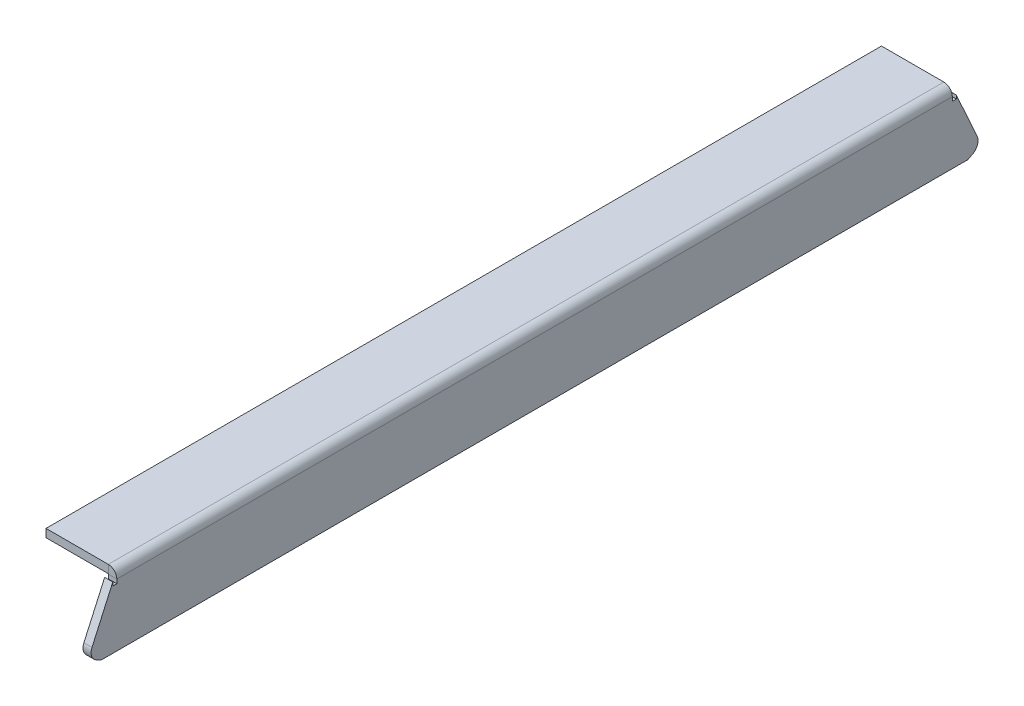
ISO-10303-21;
HEADER;
FILE_DESCRIPTION(('STEP AP214'),'2;1');
FILE_NAME('part.step','',(''),(''),'','','');
FILE_SCHEMA(('AUTOMOTIVE_DESIGN { 1 0 10303 214 1 1 1 1 }'));
ENDSEC;
DATA;
#1=APPLICATION_CONTEXT('core data for automotive mechanical design processes');
#2=APPLICATION_PROTOCOL_DEFINITION('international standard','automotive_design',2000,#1);
#3=PRODUCT_CONTEXT('',#1,'mechanical');
#4=PRODUCT('Part','Part','',(#3));
#5=PRODUCT_RELATED_PRODUCT_CATEGORY('part','',(#4));
#6=PRODUCT_DEFINITION_FORMATION('','',#4);
#7=PRODUCT_DEFINITION_CONTEXT('part definition',#1,'design');
#8=PRODUCT_DEFINITION('design','',#6,#7);
#9=PRODUCT_DEFINITION_SHAPE('','',#8);
#10=(LENGTH_UNIT() NAMED_UNIT(*) SI_UNIT(.MILLI.,.METRE.));
#11=(NAMED_UNIT(*) PLANE_ANGLE_UNIT() SI_UNIT($,.RADIAN.));
#12=(NAMED_UNIT(*) SI_UNIT($,.STERADIAN.) SOLID_ANGLE_UNIT());
#13=UNCERTAINTY_MEASURE_WITH_UNIT(LENGTH_MEASURE(1.E-05),#10,'distance_accuracy_value','');
#14=(GEOMETRIC_REPRESENTATION_CONTEXT(3) GLOBAL_UNCERTAINTY_ASSIGNED_CONTEXT((#13)) GLOBAL_UNIT_ASSIGNED_CONTEXT((#10,
#11,#12)) REPRESENTATION_CONTEXT('',''));
#15=CARTESIAN_POINT('',(0.,0.,0.));
#16=DIRECTION('',(0.,0.,1.));
#17=DIRECTION('',(1.,0.,0.));
#18=AXIS2_PLACEMENT_3D('',#15,#16,#17);
#19=CARTESIAN_POINT('',(-4.,28.9045422304651,-190.350009652526));
#20=DIRECTION('',(0.,0.,1.));
#21=DIRECTION('',(1.,0.,0.));
#22=AXIS2_PLACEMENT_3D('',#19,#20,#21);
#23=PLANE('',#22);
#24=DIRECTION('',(0.,-1.,0.));
#25=VECTOR('',#24,1.);
#26=CARTESIAN_POINT('',(0.,3.99188176989845,-190.350009652526));
#27=LINE('',#26,#25);
#28=CARTESIAN_POINT('',(0.,28.9045422304651,-190.350009652526));
#29=VERTEX_POINT('',#28);
#30=CARTESIAN_POINT('',(0.,27.1558786366371,-190.350009652526));
#31=VERTEX_POINT('',#30);
#32=EDGE_CURVE('E13',#29,#31,#27,.T.);
#33=ORIENTED_EDGE('',*,*,#32,.F.);
#34=DIRECTION('',(1.,0.,0.));
#35=VECTOR('',#34,1.);
#36=CARTESIAN_POINT('',(-4.,28.9045422304651,-190.350009652526));
#37=LINE('',#36,#35);
#38=CARTESIAN_POINT('',(-4.,28.9045422304651,-190.350009652526));
#39=VERTEX_POINT('',#38);
#40=EDGE_CURVE('E224',#39,#29,#37,.T.);
#41=ORIENTED_EDGE('',*,*,#40,.F.);
#42=DIRECTION('',(0.,-1.,0.));
#43=VECTOR('',#42,1.);
#44=CARTESIAN_POINT('',(-4.,28.9045422304651,-190.350009652526));
#45=LINE('',#44,#43);
#46=CARTESIAN_POINT('',(-4.00000000000001,27.1558786366371,-190.350009652526));
#47=VERTEX_POINT('',#46);
#48=EDGE_CURVE('E163',#39,#47,#45,.T.);
#49=ORIENTED_EDGE('',*,*,#48,.T.);
#50=DIRECTION('',(1.,0.,0.));
#51=VECTOR('',#50,1.);
#52=CARTESIAN_POINT('',(-4.00000000000001,27.1558786366371,-190.350009652526));
#53=LINE('',#52,#51);
#54=EDGE_CURVE('E213',#47,#31,#53,.T.);
#55=ORIENTED_EDGE('',*,*,#54,.T.);
#56=EDGE_LOOP('',(#33,#41,#49,#55));
#57=FACE_BOUND('',#56,.T.);
#58=ADVANCED_FACE('F57',(#57),#23,.T.);
#59=CARTESIAN_POINT('',(-4.00000000000001,27.1558786366371,-190.350009652526));
#60=DIRECTION('',(0.,1.,0.));
#61=DIRECTION('',(0.,0.,1.));
#62=AXIS2_PLACEMENT_3D('',#59,#60,#61);
#63=PLANE('',#62);
#64=DIRECTION('',(0.,0.,1.));
#65=VECTOR('',#64,1.);
#66=CARTESIAN_POINT('',(0.,27.1558786366371,-196.061850042089));
#67=LINE('',#66,#65);
#68=CARTESIAN_POINT('',(0.,27.1558786366371,-188.350009652526));
#69=VERTEX_POINT('',#68);
#70=EDGE_CURVE('E65',#31,#69,#67,.T.);
#71=ORIENTED_EDGE('',*,*,#70,.F.);
#72=ORIENTED_EDGE('',*,*,#54,.F.);
#73=DIRECTION('',(0.,0.,1.));
#74=VECTOR('',#73,1.);
#75=CARTESIAN_POINT('',(-4.00000000000001,27.1558786366371,-190.350009652526));
#76=LINE('',#75,#74);
#77=CARTESIAN_POINT('',(-4.00000000000001,27.1558786366371,-188.350009652526));
#78=VERTEX_POINT('',#77);
#79=EDGE_CURVE('E221',#47,#78,#76,.T.);
#80=ORIENTED_EDGE('',*,*,#79,.T.);
#81=DIRECTION('',(1.,0.,0.));
#82=VECTOR('',#81,1.);
#83=CARTESIAN_POINT('',(-4.00000000000001,27.1558786366371,-188.350009652526));
#84=LINE('',#83,#82);
#85=EDGE_CURVE('E216',#78,#69,#84,.T.);
#86=ORIENTED_EDGE('',*,*,#85,.T.);
#87=EDGE_LOOP('',(#71,#72,#80,#86));
#88=FACE_BOUND('',#87,.T.);
#89=ADVANCED_FACE('F210',(#88),#63,.T.);
#90=CARTESIAN_POINT('',(-4.00000000000001,27.1558786366371,-188.350009652526));
#91=DIRECTION('',(0.,0.,-1.));
#92=DIRECTION('',(-1.,0.,0.));
#93=AXIS2_PLACEMENT_3D('',#90,#91,#92);
#94=PLANE('',#93);
#95=DIRECTION('',(0.,1.,0.));
#96=VECTOR('',#95,1.);
#97=CARTESIAN_POINT('',(0.,3.99188176989845,-188.350009652526));
#98=LINE('',#97,#96);
#99=CARTESIAN_POINT('',(0.,29.1558786366371,-188.350009652526));
#100=VERTEX_POINT('',#99);
#101=EDGE_CURVE('E192',#69,#100,#98,.T.);
#102=ORIENTED_EDGE('',*,*,#101,.F.);
#103=ORIENTED_EDGE('',*,*,#85,.F.);
#104=DIRECTION('',(0.,1.,0.));
#105=VECTOR('',#104,1.);
#106=CARTESIAN_POINT('',(-4.00000000000001,27.1558786366371,-188.350009652526));
#107=LINE('',#106,#105);
#108=CARTESIAN_POINT('',(-4.00000000000001,29.1558786366371,-188.350009652526));
#109=VERTEX_POINT('',#108);
#110=EDGE_CURVE('E222',#78,#109,#107,.T.);
#111=ORIENTED_EDGE('',*,*,#110,.T.);
#112=DIRECTION('',(1.,0.,0.));
#113=VECTOR('',#112,1.);
#114=CARTESIAN_POINT('',(-4.00000000000001,29.1558786366371,-188.350009652526));
#115=LINE('',#114,#113);
#116=EDGE_CURVE('E307',#109,#100,#115,.T.);
#117=ORIENTED_EDGE('',*,*,#116,.T.);
#118=EDGE_LOOP('',(#102,#103,#111,#117));
#119=FACE_BOUND('',#118,.T.);
#120=ADVANCED_FACE('F258',(#119),#94,.T.);
#121=CARTESIAN_POINT('',(-4.00000000000001,29.1558786366371,224.59201796484));
#122=DIRECTION('',(0.,0.,1.));
#123=DIRECTION('',(1.,0.,0.));
#124=AXIS2_PLACEMENT_3D('',#121,#122,#123);
#125=PLANE('',#124);
#126=DIRECTION('',(0.,-1.,0.));
#127=VECTOR('',#126,1.);
#128=CARTESIAN_POINT('',(0.,3.99188176989845,224.59201796484));
#129=LINE('',#128,#127);
#130=CARTESIAN_POINT('',(0.,29.1558786366371,224.59201796484));
#131=VERTEX_POINT('',#130);
#132=CARTESIAN_POINT('',(0.,27.1558786366371,224.59201796484));
#133=VERTEX_POINT('',#132);
#134=EDGE_CURVE('E189',#131,#133,#129,.T.);
#135=ORIENTED_EDGE('',*,*,#134,.F.);
#136=DIRECTION('',(1.,0.,0.));
#137=VECTOR('',#136,1.);
#138=CARTESIAN_POINT('',(-4.00000000000001,29.1558786366371,224.59201796484));
#139=LINE('',#138,#137);
#140=CARTESIAN_POINT('',(-4.00000000000001,29.1558786366371,224.59201796484));
#141=VERTEX_POINT('',#140);
#142=EDGE_CURVE('E318',#141,#131,#139,.T.);
#143=ORIENTED_EDGE('',*,*,#142,.F.);
#144=DIRECTION('',(0.,-1.,0.));
#145=VECTOR('',#144,1.);
#146=CARTESIAN_POINT('',(-4.00000000000001,29.1558786366371,224.59201796484));
#147=LINE('',#146,#145);
#148=CARTESIAN_POINT('',(-4.00000000000001,27.1558786366371,224.59201796484));
#149=VERTEX_POINT('',#148);
#150=EDGE_CURVE('E330',#141,#149,#147,.T.);
#151=ORIENTED_EDGE('',*,*,#150,.T.);
#152=DIRECTION('',(1.,0.,0.));
#153=VECTOR('',#152,1.);
#154=CARTESIAN_POINT('',(-4.00000000000001,27.1558786366371,224.59201796484));
#155=LINE('',#154,#153);
#156=EDGE_CURVE('E336',#149,#133,#155,.T.);
#157=ORIENTED_EDGE('',*,*,#156,.T.);
#158=EDGE_LOOP('',(#135,#143,#151,#157));
#159=FACE_BOUND('',#158,.T.);
#160=ADVANCED_FACE('F296',(#159),#125,.T.);
#161=CARTESIAN_POINT('',(-4.00000000000001,27.1558786366371,224.59201796484));
#162=DIRECTION('',(0.,1.,0.));
#163=DIRECTION('',(0.,0.,1.));
#164=AXIS2_PLACEMENT_3D('',#161,#162,#163);
#165=PLANE('',#164);
#166=DIRECTION('',(0.,0.,1.));
#167=VECTOR('',#166,1.);
#168=CARTESIAN_POINT('',(0.,27.1558786366371,-196.061850042089));
#169=LINE('',#168,#167);
#170=CARTESIAN_POINT('',(0.,27.1558786366371,226.59201796484));
#171=VERTEX_POINT('',#170);
#172=EDGE_CURVE('E186',#133,#171,#169,.T.);
#173=ORIENTED_EDGE('',*,*,#172,.F.);
#174=ORIENTED_EDGE('',*,*,#156,.F.);
#175=DIRECTION('',(0.,0.,1.));
#176=VECTOR('',#175,1.);
#177=CARTESIAN_POINT('',(-4.00000000000001,27.1558786366371,224.59201796484));
#178=LINE('',#177,#176);
#179=CARTESIAN_POINT('',(-4.00000000000001,27.1558786366371,226.59201796484));
#180=VERTEX_POINT('',#179);
#181=EDGE_CURVE('E333',#149,#180,#178,.T.);
#182=ORIENTED_EDGE('',*,*,#181,.T.);
#183=DIRECTION('',(1.,0.,0.));
#184=VECTOR('',#183,1.);
#185=CARTESIAN_POINT('',(-4.00000000000001,27.1558786366371,226.59201796484));
#186=LINE('',#185,#184);
#187=EDGE_CURVE('E322',#180,#171,#186,.T.);
#188=ORIENTED_EDGE('',*,*,#187,.T.);
#189=EDGE_LOOP('',(#173,#174,#182,#188));
#190=FACE_BOUND('',#189,.T.);
#191=ADVANCED_FACE('F293',(#190),#165,.T.);
#192=CARTESIAN_POINT('',(-4.00000000000001,27.1558786366371,226.59201796484));
#193=DIRECTION('',(0.,0.,-1.));
#194=DIRECTION('',(-1.,0.,0.));
#195=AXIS2_PLACEMENT_3D('',#192,#193,#194);
#196=PLANE('',#195);
#197=DIRECTION('',(0.,1.,0.));
#198=VECTOR('',#197,1.);
#199=CARTESIAN_POINT('',(0.,3.99188176989845,226.59201796484));
#200=LINE('',#199,#198);
#201=CARTESIAN_POINT('',(0.,28.9045422304651,226.59201796484));
#202=VERTEX_POINT('',#201);
#203=EDGE_CURVE('E179',#171,#202,#200,.T.);
#204=ORIENTED_EDGE('',*,*,#203,.F.);
#205=ORIENTED_EDGE('',*,*,#187,.F.);
#206=DIRECTION('',(0.,1.,0.));
#207=VECTOR('',#206,1.);
#208=CARTESIAN_POINT('',(-4.00000000000001,27.1558786366371,226.59201796484));
#209=LINE('',#208,#207);
#210=CARTESIAN_POINT('',(-4.,28.9045422304651,226.59201796484));
#211=VERTEX_POINT('',#210);
#212=EDGE_CURVE('E337',#180,#211,#209,.T.);
#213=ORIENTED_EDGE('',*,*,#212,.T.);
#214=DIRECTION('',(1.,0.,0.));
#215=VECTOR('',#214,1.);
#216=CARTESIAN_POINT('',(-4.,28.9045422304651,226.59201796484));
#217=LINE('',#216,#215);
#218=EDGE_CURVE('E72',#211,#202,#217,.T.);
#219=ORIENTED_EDGE('',*,*,#218,.T.);
#220=EDGE_LOOP('',(#204,#205,#213,#219));
#221=FACE_BOUND('',#220,.T.);
#222=ADVANCED_FACE('F251',(#221),#196,.T.);
#223=CARTESIAN_POINT('',(-4.,33.3558786366371,-188.350009652526));
#224=DIRECTION('',(0.,0.409836101706065,-0.912159180043909));
#225=DIRECTION('',(0.,0.912159180043909,0.409836101706065));
#226=AXIS2_PLACEMENT_3D('',#223,#224,#225);
#227=PLANE('',#226);
#228=DIRECTION('',(0.,0.912159180043909,0.409836101706065));
#229=VECTOR('',#228,1.);
#230=CARTESIAN_POINT('',(-4.,33.3558786366371,-188.350009652526));
#231=LINE('',#230,#229);
#232=CARTESIAN_POINT('',(-4.,6.04106227842876,-200.622645942309));
#233=VERTEX_POINT('',#232);
#234=EDGE_CURVE('E177',#233,#39,#231,.T.);
#235=ORIENTED_EDGE('',*,*,#234,.T.);
#236=ORIENTED_EDGE('',*,*,#40,.T.);
#237=DIRECTION('',(0.,0.912159180043909,0.409836101706065));
#238=VECTOR('',#237,1.);
#239=CARTESIAN_POINT('',(0.,33.3558786366371,-188.350009652526));
#240=LINE('',#239,#238);
#241=CARTESIAN_POINT('',(0.,6.04106227842876,-200.622645942309));
#242=VERTEX_POINT('',#241);
#243=EDGE_CURVE('E159',#242,#29,#240,.T.);
#244=ORIENTED_EDGE('',*,*,#243,.F.);
#245=DIRECTION('',(1.,0.,0.));
#246=VECTOR('',#245,1.);
#247=CARTESIAN_POINT('',(-4.,6.04106227842876,-200.622645942309));
#248=LINE('',#247,#246);
#249=EDGE_CURVE('E81',#233,#242,#248,.T.);
#250=ORIENTED_EDGE('',*,*,#249,.F.);
#251=EDGE_LOOP('',(#235,#236,#244,#250));
#252=FACE_BOUND('',#251,.T.);
#253=ADVANCED_FACE('F59',(#252),#227,.T.);
#254=CARTESIAN_POINT('',(-4.,33.3558786366371,224.59201796484));
#255=DIRECTION('',(0.,0.409836101706065,0.912159180043909));
#256=DIRECTION('',(0.,-0.912159180043909,0.409836101706065));
#257=AXIS2_PLACEMENT_3D('',#254,#255,#256);
#258=PLANE('',#257);
#259=DIRECTION('',(0.,-0.912159180043909,0.409836101706065));
#260=VECTOR('',#259,1.);
#261=CARTESIAN_POINT('',(0.,33.3558786366371,224.59201796484));
#262=LINE('',#261,#260);
#263=CARTESIAN_POINT('',(0.,6.04106227842877,236.864654254622));
#264=VERTEX_POINT('',#263);
#265=EDGE_CURVE('E162',#202,#264,#262,.T.);
#266=ORIENTED_EDGE('',*,*,#265,.F.);
#267=ORIENTED_EDGE('',*,*,#218,.F.);
#268=DIRECTION('',(0.,-0.912159180043909,0.409836101706065));
#269=VECTOR('',#268,1.);
#270=CARTESIAN_POINT('',(-4.,33.3558786366371,224.59201796484));
#271=LINE('',#270,#269);
#272=CARTESIAN_POINT('',(-4.,6.04106227842877,236.864654254622));
#273=VERTEX_POINT('',#272);
#274=EDGE_CURVE('E114',#211,#273,#271,.T.);
#275=ORIENTED_EDGE('',*,*,#274,.T.);
#276=DIRECTION('',(1.,0.,0.));
#277=VECTOR('',#276,1.);
#278=CARTESIAN_POINT('',(-4.,6.04106227842877,236.864654254622));
#279=LINE('',#278,#277);
#280=EDGE_CURVE('E158',#273,#264,#279,.T.);
#281=ORIENTED_EDGE('',*,*,#280,.T.);
#282=EDGE_LOOP('',(#266,#267,#275,#281));
#283=FACE_BOUND('',#282,.T.);
#284=ADVANCED_FACE('F244',(#283),#258,.T.);
#285=CARTESIAN_POINT('',(-4.,3.99188176989845,-196.061850042089));
#286=DIRECTION('',(1.,0.,0.));
#287=DIRECTION('',(0.,0.,-1.));
#288=AXIS2_PLACEMENT_3D('',#285,#286,#287);
#289=PLANE('',#288);
#290=ORIENTED_EDGE('',*,*,#48,.F.);
#291=ORIENTED_EDGE('',*,*,#234,.F.);
#292=CARTESIAN_POINT('',(-4.,3.99188176989845,-196.061850042089));
#293=DIRECTION('',(1.,0.,0.));
#294=DIRECTION('',(0.,0.,-1.));
#295=AXIS2_PLACEMENT_3D('',#292,#293,#294);
#296=CIRCLE('',#295,5.00000000000002);
#297=CARTESIAN_POINT('',(-4.,-0.468333374673377,-198.321602432094));
#298=VERTEX_POINT('',#297);
#299=EDGE_CURVE('E148',#298,#233,#296,.T.);
#300=ORIENTED_EDGE('',*,*,#299,.F.);
#301=DIRECTION('',(0.,0.451950478000946,-0.892043028914366));
#302=VECTOR('',#301,1.);
#303=CARTESIAN_POINT('',(-4.,-0.468333374673377,-198.321602432094));
#304=LINE('',#303,#302);
#305=CARTESIAN_POINT('',(-4.,-1.64412136336288,-196.000875870567));
#306=VERTEX_POINT('',#305);
#307=EDGE_CURVE('E130',#306,#298,#304,.T.);
#308=ORIENTED_EDGE('',*,*,#307,.F.);
#309=DIRECTION('',(0.,0.,-1.));
#310=VECTOR('',#309,1.);
#311=CARTESIAN_POINT('',(-4.,-1.64412136336288,-196.000875870567));
#312=LINE('',#311,#310);
#313=CARTESIAN_POINT('',(-4.,-1.64412136336285,232.24288418288));
#314=VERTEX_POINT('',#313);
#315=EDGE_CURVE('E146',#314,#306,#312,.T.);
#316=ORIENTED_EDGE('',*,*,#315,.F.);
#317=DIRECTION('',(0.,-0.451950478000946,-0.892043028914366));
#318=VECTOR('',#317,1.);
#319=CARTESIAN_POINT('',(-4.,-0.468333374673377,234.563610744408));
#320=LINE('',#319,#318);
#321=CARTESIAN_POINT('',(-4.,-0.468333374673383,234.563610744408));
#322=VERTEX_POINT('',#321);
#323=EDGE_CURVE('E151',#322,#314,#320,.T.);
#324=ORIENTED_EDGE('',*,*,#323,.F.);
#325=CARTESIAN_POINT('',(-4.,3.99188176989845,232.303858354403));
#326=DIRECTION('',(1.,0.,0.));
#327=DIRECTION('',(0.,0.,-1.));
#328=AXIS2_PLACEMENT_3D('',#325,#326,#327);
#329=CIRCLE('',#328,5.00000000000002);
#330=EDGE_CURVE('E153',#273,#322,#329,.T.);
#331=ORIENTED_EDGE('',*,*,#330,.F.);
#332=ORIENTED_EDGE('',*,*,#274,.F.);
#333=ORIENTED_EDGE('',*,*,#212,.F.);
#334=ORIENTED_EDGE('',*,*,#181,.F.);
#335=ORIENTED_EDGE('',*,*,#150,.F.);
#336=DIRECTION('',(0.,0.,-1.));
#337=VECTOR('',#336,1.);
#338=CARTESIAN_POINT('',(-4.00000000000001,29.1558786366371,-188.350009652526));
#339=LINE('',#338,#337);
#340=EDGE_CURVE('E366',#109,#141,#339,.F.);
#341=ORIENTED_EDGE('',*,*,#340,.F.);
#342=ORIENTED_EDGE('',*,*,#110,.F.);
#343=ORIENTED_EDGE('',*,*,#79,.F.);
#344=EDGE_LOOP('',(#290,#291,#300,#308,#316,#324,#331,#332,#333,#334,#335,#341,#342,#343));
#345=FACE_BOUND('',#344,.T.);
#346=ADVANCED_FACE('F144',(#345),#289,.F.);
#347=CARTESIAN_POINT('',(0.,3.99188176989845,-196.061850042089));
#348=DIRECTION('',(1.,0.,0.));
#349=DIRECTION('',(0.,0.,-1.));
#350=AXIS2_PLACEMENT_3D('',#347,#348,#349);
#351=PLANE('',#350);
#352=ORIENTED_EDGE('',*,*,#243,.T.);
#353=ORIENTED_EDGE('',*,*,#32,.T.);
#354=ORIENTED_EDGE('',*,*,#70,.T.);
#355=ORIENTED_EDGE('',*,*,#101,.T.);
#356=DIRECTION('',(0.,0.,-1.));
#357=VECTOR('',#356,1.);
#358=CARTESIAN_POINT('',(0.,29.1558786366371,-188.350009652526));
#359=LINE('',#358,#357);
#360=EDGE_CURVE('E325',#100,#131,#359,.F.);
#361=ORIENTED_EDGE('',*,*,#360,.T.);
#362=ORIENTED_EDGE('',*,*,#134,.T.);
#363=ORIENTED_EDGE('',*,*,#172,.T.);
#364=ORIENTED_EDGE('',*,*,#203,.T.);
#365=ORIENTED_EDGE('',*,*,#265,.T.);
#366=CARTESIAN_POINT('',(0.,3.99188176989845,232.303858354403));
#367=DIRECTION('',(1.,0.,0.));
#368=DIRECTION('',(0.,0.,-1.));
#369=AXIS2_PLACEMENT_3D('',#366,#367,#368);
#370=CIRCLE('',#369,5.00000000000002);
#371=CARTESIAN_POINT('',(0.,-0.468333374673383,234.563610744408));
#372=VERTEX_POINT('',#371);
#373=EDGE_CURVE('E165',#264,#372,#370,.T.);
#374=ORIENTED_EDGE('',*,*,#373,.T.);
#375=DIRECTION('',(0.,-0.451950478000946,-0.892043028914366));
#376=VECTOR('',#375,1.);
#377=CARTESIAN_POINT('',(0.,-0.468333374673377,234.563610744408));
#378=LINE('',#377,#376);
#379=CARTESIAN_POINT('',(0.,-1.64412136336285,232.24288418288));
#380=VERTEX_POINT('',#379);
#381=EDGE_CURVE('E168',#372,#380,#378,.T.);
#382=ORIENTED_EDGE('',*,*,#381,.T.);
#383=DIRECTION('',(0.,0.,-1.));
#384=VECTOR('',#383,1.);
#385=CARTESIAN_POINT('',(0.,-1.64412136336288,-196.000875870567));
#386=LINE('',#385,#384);
#387=CARTESIAN_POINT('',(0.,-1.64412136336288,-196.000875870567));
#388=VERTEX_POINT('',#387);
#389=EDGE_CURVE('E171',#380,#388,#386,.T.);
#390=ORIENTED_EDGE('',*,*,#389,.T.);
#391=DIRECTION('',(0.,0.451950478000946,-0.892043028914366));
#392=VECTOR('',#391,1.);
#393=CARTESIAN_POINT('',(0.,-0.468333374673377,-198.321602432094));
#394=LINE('',#393,#392);
#395=CARTESIAN_POINT('',(0.,-0.468333374673377,-198.321602432094));
#396=VERTEX_POINT('',#395);
#397=EDGE_CURVE('E133',#388,#396,#394,.T.);
#398=ORIENTED_EDGE('',*,*,#397,.T.);
#399=CARTESIAN_POINT('',(0.,3.99188176989845,-196.061850042089));
#400=DIRECTION('',(1.,0.,0.));
#401=DIRECTION('',(0.,0.,-1.));
#402=AXIS2_PLACEMENT_3D('',#399,#400,#401);
#403=CIRCLE('',#402,5.00000000000002);
#404=EDGE_CURVE('E174',#396,#242,#403,.T.);
#405=ORIENTED_EDGE('',*,*,#404,.T.);
#406=EDGE_LOOP('',(#352,#353,#354,#355,#361,#362,#363,#364,#365,#374,#382,#390,#398,#405));
#407=FACE_BOUND('',#406,.T.);
#408=ADVANCED_FACE('F198',(#407),#351,.T.);
#409=CARTESIAN_POINT('',(-4.,3.99188176989845,-196.061850042089));
#410=DIRECTION('',(1.,0.,0.));
#411=DIRECTION('',(0.,0.,-1.));
#412=AXIS2_PLACEMENT_3D('',#409,#410,#411);
#413=CYLINDRICAL_SURFACE('',#412,5.00000000000002);
#414=ORIENTED_EDGE('',*,*,#404,.F.);
#415=DIRECTION('',(1.,0.,0.));
#416=VECTOR('',#415,1.);
#417=CARTESIAN_POINT('',(-4.,-0.468333374673377,-198.321602432094));
#418=LINE('',#417,#416);
#419=EDGE_CURVE('E138',#298,#396,#418,.T.);
#420=ORIENTED_EDGE('',*,*,#419,.F.);
#421=ORIENTED_EDGE('',*,*,#299,.T.);
#422=ORIENTED_EDGE('',*,*,#249,.T.);
#423=EDGE_LOOP('',(#414,#420,#421,#422));
#424=FACE_BOUND('',#423,.T.);
#425=ADVANCED_FACE('F264',(#424),#413,.T.);
#426=CARTESIAN_POINT('',(-4.,-0.468333374673377,-198.321602432094));
#427=DIRECTION('',(0.,-0.892043028914366,-0.451950478000946));
#428=DIRECTION('',(0.,0.451950478000946,-0.892043028914366));
#429=AXIS2_PLACEMENT_3D('',#426,#427,#428);
#430=PLANE('',#429);
#431=ORIENTED_EDGE('',*,*,#397,.F.);
#432=DIRECTION('',(1.,0.,0.));
#433=VECTOR('',#432,1.);
#434=CARTESIAN_POINT('',(-4.,-1.64412136336288,-196.000875870567));
#435=LINE('',#434,#433);
#436=EDGE_CURVE('E127',#306,#388,#435,.T.);
#437=ORIENTED_EDGE('',*,*,#436,.F.);
#438=ORIENTED_EDGE('',*,*,#307,.T.);
#439=ORIENTED_EDGE('',*,*,#419,.T.);
#440=EDGE_LOOP('',(#431,#437,#438,#439));
#441=FACE_BOUND('',#440,.T.);
#442=ADVANCED_FACE('F129',(#441),#430,.T.);
#443=CARTESIAN_POINT('',(-4.,-1.64412136336288,-196.000875870567));
#444=DIRECTION('',(0.,-1.,0.));
#445=DIRECTION('',(0.,0.,-1.));
#446=AXIS2_PLACEMENT_3D('',#443,#444,#445);
#447=PLANE('',#446);
#448=ORIENTED_EDGE('',*,*,#389,.F.);
#449=DIRECTION('',(1.,0.,0.));
#450=VECTOR('',#449,1.);
#451=CARTESIAN_POINT('',(-4.,-1.64412136336285,232.24288418288));
#452=LINE('',#451,#450);
#453=EDGE_CURVE('E139',#314,#380,#452,.T.);
#454=ORIENTED_EDGE('',*,*,#453,.F.);
#455=ORIENTED_EDGE('',*,*,#315,.T.);
#456=ORIENTED_EDGE('',*,*,#436,.T.);
#457=EDGE_LOOP('',(#448,#454,#455,#456));
#458=FACE_BOUND('',#457,.T.);
#459=ADVANCED_FACE('F150',(#458),#447,.T.);
#460=CARTESIAN_POINT('',(-4.,-0.468333374673377,234.563610744408));
#461=DIRECTION('',(0.,-0.892043028914366,0.451950478000946));
#462=DIRECTION('',(0.,-0.451950478000946,-0.892043028914366));
#463=AXIS2_PLACEMENT_3D('',#460,#461,#462);
#464=PLANE('',#463);
#465=ORIENTED_EDGE('',*,*,#381,.F.);
#466=DIRECTION('',(1.,0.,0.));
#467=VECTOR('',#466,1.);
#468=CARTESIAN_POINT('',(-4.,-0.468333374673383,234.563610744408));
#469=LINE('',#468,#467);
#470=EDGE_CURVE('E182',#322,#372,#469,.T.);
#471=ORIENTED_EDGE('',*,*,#470,.F.);
#472=ORIENTED_EDGE('',*,*,#323,.T.);
#473=ORIENTED_EDGE('',*,*,#453,.T.);
#474=EDGE_LOOP('',(#465,#471,#472,#473));
#475=FACE_BOUND('',#474,.T.);
#476=ADVANCED_FACE('F242',(#475),#464,.T.);
#477=CARTESIAN_POINT('',(-4.,3.99188176989845,232.303858354403));
#478=DIRECTION('',(1.,0.,0.));
#479=DIRECTION('',(0.,0.,-1.));
#480=AXIS2_PLACEMENT_3D('',#477,#478,#479);
#481=CYLINDRICAL_SURFACE('',#480,5.00000000000002);
#482=ORIENTED_EDGE('',*,*,#373,.F.);
#483=ORIENTED_EDGE('',*,*,#280,.F.);
#484=ORIENTED_EDGE('',*,*,#330,.T.);
#485=ORIENTED_EDGE('',*,*,#470,.T.);
#486=EDGE_LOOP('',(#482,#483,#484,#485));
#487=FACE_BOUND('',#486,.T.);
#488=ADVANCED_FACE('F237',(#487),#481,.T.);
#489=CARTESIAN_POINT('',(-4.20000000000001,29.1558786366371,224.59201796484));
#490=DIRECTION('',(0.,0.,1.));
#491=DIRECTION('',(1.,0.,0.));
#492=AXIS2_PLACEMENT_3D('',#489,#490,#491);
#493=PLANE('',#492);
#494=DIRECTION('',(0.,1.,0.));
#495=VECTOR('',#494,1.);
#496=CARTESIAN_POINT('',(-4.19999999999999,33.3558786366371,224.59201796484));
#497=LINE('',#496,#495);
#498=CARTESIAN_POINT('',(-4.20000000000001,29.3558786366371,224.59201796484));
#499=VERTEX_POINT('',#498);
#500=CARTESIAN_POINT('',(-4.19999999999999,33.3558786366371,224.59201796484));
#501=VERTEX_POINT('',#500);
#502=EDGE_CURVE('E361',#499,#501,#497,.T.);
#503=ORIENTED_EDGE('',*,*,#502,.F.);
#504=CARTESIAN_POINT('',(-4.20000000000001,29.1558786366371,224.59201796484));
#505=DIRECTION('',(0.,0.,-1.));
#506=DIRECTION('',(-1.,0.,0.));
#507=AXIS2_PLACEMENT_3D('',#504,#505,#506);
#508=CIRCLE('',#507,0.199999999999999);
#509=EDGE_CURVE('E358',#141,#499,#508,.F.);
#510=ORIENTED_EDGE('',*,*,#509,.F.);
#511=ORIENTED_EDGE('',*,*,#142,.T.);
#512=CARTESIAN_POINT('',(-4.20000000000001,29.1558786366371,224.59201796484));
#513=DIRECTION('',(0.,0.,-1.));
#514=DIRECTION('',(-1.,0.,0.));
#515=AXIS2_PLACEMENT_3D('',#512,#513,#514);
#516=CIRCLE('',#515,4.2);
#517=EDGE_CURVE('E319',#131,#501,#516,.F.);
#518=ORIENTED_EDGE('',*,*,#517,.T.);
#519=EDGE_LOOP('',(#503,#510,#511,#518));
#520=FACE_BOUND('',#519,.T.);
#521=ADVANCED_FACE('F273',(#520),#493,.T.);
#522=CARTESIAN_POINT('',(-4.20000000000001,29.1558786366371,-188.350009652526));
#523=DIRECTION('',(0.,0.,1.));
#524=DIRECTION('',(1.,0.,0.));
#525=AXIS2_PLACEMENT_3D('',#522,#523,#524);
#526=PLANE('',#525);
#527=CARTESIAN_POINT('',(-4.20000000000001,29.1558786366371,-188.350009652526));
#528=DIRECTION('',(0.,0.,-1.));
#529=DIRECTION('',(-1.,0.,0.));
#530=AXIS2_PLACEMENT_3D('',#527,#528,#529);
#531=CIRCLE('',#530,0.199999999999999);
#532=CARTESIAN_POINT('',(-4.20000000000001,29.3558786366371,-188.350009652526));
#533=VERTEX_POINT('',#532);
#534=EDGE_CURVE('E368',#533,#109,#531,.T.);
#535=ORIENTED_EDGE('',*,*,#534,.F.);
#536=DIRECTION('',(0.,1.,0.));
#537=VECTOR('',#536,1.);
#538=CARTESIAN_POINT('',(-4.20000000000001,29.3558786366371,-188.350009652526));
#539=LINE('',#538,#537);
#540=CARTESIAN_POINT('',(-4.19999999999999,33.3558786366371,-188.350009652526));
#541=VERTEX_POINT('',#540);
#542=EDGE_CURVE('E403',#533,#541,#539,.T.);
#543=ORIENTED_EDGE('',*,*,#542,.T.);
#544=CARTESIAN_POINT('',(-4.20000000000001,29.1558786366371,-188.350009652526));
#545=DIRECTION('',(0.,0.,-1.));
#546=DIRECTION('',(-1.,0.,0.));
#547=AXIS2_PLACEMENT_3D('',#544,#545,#546);
#548=CIRCLE('',#547,4.2);
#549=EDGE_CURVE('E356',#541,#100,#548,.T.);
#550=ORIENTED_EDGE('',*,*,#549,.T.);
#551=ORIENTED_EDGE('',*,*,#116,.F.);
#552=EDGE_LOOP('',(#535,#543,#550,#551));
#553=FACE_BOUND('',#552,.T.);
#554=ADVANCED_FACE('F277',(#553),#526,.F.);
#555=CARTESIAN_POINT('',(-4.20000000000001,29.1558786366371,-188.350009652526));
#556=DIRECTION('',(0.,0.,-1.));
#557=DIRECTION('',(0.,1.,0.));
#558=AXIS2_PLACEMENT_3D('',#555,#556,#557);
#559=CYLINDRICAL_SURFACE('',#558,4.2);
#560=ORIENTED_EDGE('',*,*,#360,.F.);
#561=ORIENTED_EDGE('',*,*,#549,.F.);
#562=DIRECTION('',(0.,0.,-1.));
#563=VECTOR('',#562,1.);
#564=CARTESIAN_POINT('',(-4.19999999999999,33.3558786366371,0.));
#565=LINE('',#564,#563);
#566=EDGE_CURVE('E400',#501,#541,#565,.T.);
#567=ORIENTED_EDGE('',*,*,#566,.F.);
#568=ORIENTED_EDGE('',*,*,#517,.F.);
#569=EDGE_LOOP('',(#560,#561,#567,#568));
#570=FACE_BOUND('',#569,.T.);
#571=ADVANCED_FACE('F283',(#570),#559,.T.);
#572=CARTESIAN_POINT('',(-4.20000000000001,29.1558786366371,-188.350009652526));
#573=DIRECTION('',(0.,0.,-1.));
#574=DIRECTION('',(0.,1.,0.));
#575=AXIS2_PLACEMENT_3D('',#572,#573,#574);
#576=CYLINDRICAL_SURFACE('',#575,0.199999999999999);
#577=ORIENTED_EDGE('',*,*,#340,.T.);
#578=ORIENTED_EDGE('',*,*,#509,.T.);
#579=DIRECTION('',(0.,0.,1.));
#580=VECTOR('',#579,1.);
#581=CARTESIAN_POINT('',(-4.2,29.3558786366371,224.59201796484));
#582=LINE('',#581,#580);
#583=EDGE_CURVE('E405',#499,#533,#582,.F.);
#584=ORIENTED_EDGE('',*,*,#583,.T.);
#585=ORIENTED_EDGE('',*,*,#534,.T.);
#586=EDGE_LOOP('',(#577,#578,#584,#585));
#587=FACE_BOUND('',#586,.T.);
#588=ADVANCED_FACE('F288',(#587),#576,.F.);
#589=CARTESIAN_POINT('',(-3.99999999999999,33.3558786366371,-188.350009652526));
#590=DIRECTION('',(0.,0.,-1.));
#591=DIRECTION('',(-1.,0.,0.));
#592=AXIS2_PLACEMENT_3D('',#589,#590,#591);
#593=PLANE('',#592);
#594=DIRECTION('',(1.,0.,0.));
#595=VECTOR('',#594,1.);
#596=CARTESIAN_POINT('',(-3.99999999999999,33.3558786366371,-188.350009652526));
#597=LINE('',#596,#595);
#598=CARTESIAN_POINT('',(-35.,33.3558786366372,-188.350009652526));
#599=VERTEX_POINT('',#598);
#600=EDGE_CURVE('E382',#599,#541,#597,.T.);
#601=ORIENTED_EDGE('',*,*,#600,.T.);
#602=ORIENTED_EDGE('',*,*,#542,.F.);
#603=DIRECTION('',(-1.,0.,0.));
#604=VECTOR('',#603,1.);
#605=CARTESIAN_POINT('',(1.19459562803216E-13,29.3558786366371,-188.350009652526));
#606=LINE('',#605,#604);
#607=CARTESIAN_POINT('',(-35.,29.3558786366372,-188.350009652526));
#608=VERTEX_POINT('',#607);
#609=EDGE_CURVE('E392',#608,#533,#606,.F.);
#610=ORIENTED_EDGE('',*,*,#609,.F.);
#611=DIRECTION('',(0.,-1.,0.));
#612=VECTOR('',#611,1.);
#613=CARTESIAN_POINT('',(-35.,33.3558786366372,-188.350009652526));
#614=LINE('',#613,#612);
#615=EDGE_CURVE('E369',#599,#608,#614,.T.);
#616=ORIENTED_EDGE('',*,*,#615,.F.);
#617=EDGE_LOOP('',(#601,#602,#610,#616));
#618=FACE_BOUND('',#617,.T.);
#619=ADVANCED_FACE('F449',(#618),#593,.T.);
#620=CARTESIAN_POINT('',(-35.,33.3558786366372,224.59201796484));
#621=DIRECTION('',(0.,0.,1.));
#622=DIRECTION('',(1.,0.,0.));
#623=AXIS2_PLACEMENT_3D('',#620,#621,#622);
#624=PLANE('',#623);
#625=DIRECTION('',(1.,0.,0.));
#626=VECTOR('',#625,1.);
#627=CARTESIAN_POINT('',(1.19459562803216E-13,29.3558786366371,224.59201796484));
#628=LINE('',#627,#626);
#629=CARTESIAN_POINT('',(-35.,29.3558786366372,224.59201796484));
#630=VERTEX_POINT('',#629);
#631=EDGE_CURVE('E397',#499,#630,#628,.F.);
#632=ORIENTED_EDGE('',*,*,#631,.F.);
#633=ORIENTED_EDGE('',*,*,#502,.T.);
#634=DIRECTION('',(-1.,0.,0.));
#635=VECTOR('',#634,1.);
#636=CARTESIAN_POINT('',(-35.,33.3558786366372,224.59201796484));
#637=LINE('',#636,#635);
#638=CARTESIAN_POINT('',(-35.,33.3558786366372,224.59201796484));
#639=VERTEX_POINT('',#638);
#640=EDGE_CURVE('E389',#501,#639,#637,.T.);
#641=ORIENTED_EDGE('',*,*,#640,.T.);
#642=DIRECTION('',(0.,-1.,0.));
#643=VECTOR('',#642,1.);
#644=CARTESIAN_POINT('',(-35.,33.3558786366372,224.59201796484));
#645=LINE('',#644,#643);
#646=EDGE_CURVE('E373',#639,#630,#645,.T.);
#647=ORIENTED_EDGE('',*,*,#646,.T.);
#648=EDGE_LOOP('',(#632,#633,#641,#647));
#649=FACE_BOUND('',#648,.T.);
#650=ADVANCED_FACE('F412',(#649),#624,.T.);
#651=CARTESIAN_POINT('',(1.33425488158588E-13,33.3558786366371,0.));
#652=DIRECTION('',(0.,1.,0.));
#653=DIRECTION('',(-1.,0.,0.));
#654=AXIS2_PLACEMENT_3D('',#651,#652,#653);
#655=PLANE('',#654);
#656=ORIENTED_EDGE('',*,*,#640,.F.);
#657=ORIENTED_EDGE('',*,*,#566,.T.);
#658=ORIENTED_EDGE('',*,*,#600,.F.);
#659=DIRECTION('',(0.,0.,-1.));
#660=VECTOR('',#659,1.);
#661=CARTESIAN_POINT('',(-35.,33.3558786366372,-188.350009652526));
#662=LINE('',#661,#660);
#663=EDGE_CURVE('E387',#639,#599,#662,.T.);
#664=ORIENTED_EDGE('',*,*,#663,.F.);
#665=EDGE_LOOP('',(#656,#657,#658,#664));
#666=FACE_BOUND('',#665,.T.);
#667=ADVANCED_FACE('F422',(#666),#655,.T.);
#668=CARTESIAN_POINT('',(1.19459562803216E-13,29.3558786366371,0.));
#669=DIRECTION('',(0.,1.,0.));
#670=DIRECTION('',(-1.,0.,0.));
#671=AXIS2_PLACEMENT_3D('',#668,#669,#670);
#672=PLANE('',#671);
#673=ORIENTED_EDGE('',*,*,#583,.F.);
#674=ORIENTED_EDGE('',*,*,#631,.T.);
#675=DIRECTION('',(0.,0.,1.));
#676=VECTOR('',#675,1.);
#677=CARTESIAN_POINT('',(-35.,29.3558786366372,0.));
#678=LINE('',#677,#676);
#679=EDGE_CURVE('E395',#630,#608,#678,.F.);
#680=ORIENTED_EDGE('',*,*,#679,.T.);
#681=ORIENTED_EDGE('',*,*,#609,.T.);
#682=EDGE_LOOP('',(#673,#674,#680,#681));
#683=FACE_BOUND('',#682,.T.);
#684=ADVANCED_FACE('F451',(#683),#672,.F.);
#685=CARTESIAN_POINT('',(-35.,33.3558786366372,-188.350009652526));
#686=DIRECTION('',(-1.,0.,0.));
#687=DIRECTION('',(0.,-1.,0.));
#688=AXIS2_PLACEMENT_3D('',#685,#686,#687);
#689=PLANE('',#688);
#690=ORIENTED_EDGE('',*,*,#679,.F.);
#691=ORIENTED_EDGE('',*,*,#646,.F.);
#692=ORIENTED_EDGE('',*,*,#663,.T.);
#693=ORIENTED_EDGE('',*,*,#615,.T.);
#694=EDGE_LOOP('',(#690,#691,#692,#693));
#695=FACE_BOUND('',#694,.T.);
#696=ADVANCED_FACE('F427',(#695),#689,.T.);
#697=CLOSED_SHELL('',(#58,#89,#120,#160,#191,#222,#253,#284,#346,#408,#425,#442,#459,#476,#488,
#521,#554,#571,#588,#619,#650,#667,#684,#696));
#698=MANIFOLD_SOLID_BREP('B2',#697);
#699=ADVANCED_BREP_SHAPE_REPRESENTATION('',(#18,#698),#14);
#700=SHAPE_DEFINITION_REPRESENTATION(#9,#699);
ENDSEC;
END-ISO-10303-21;
